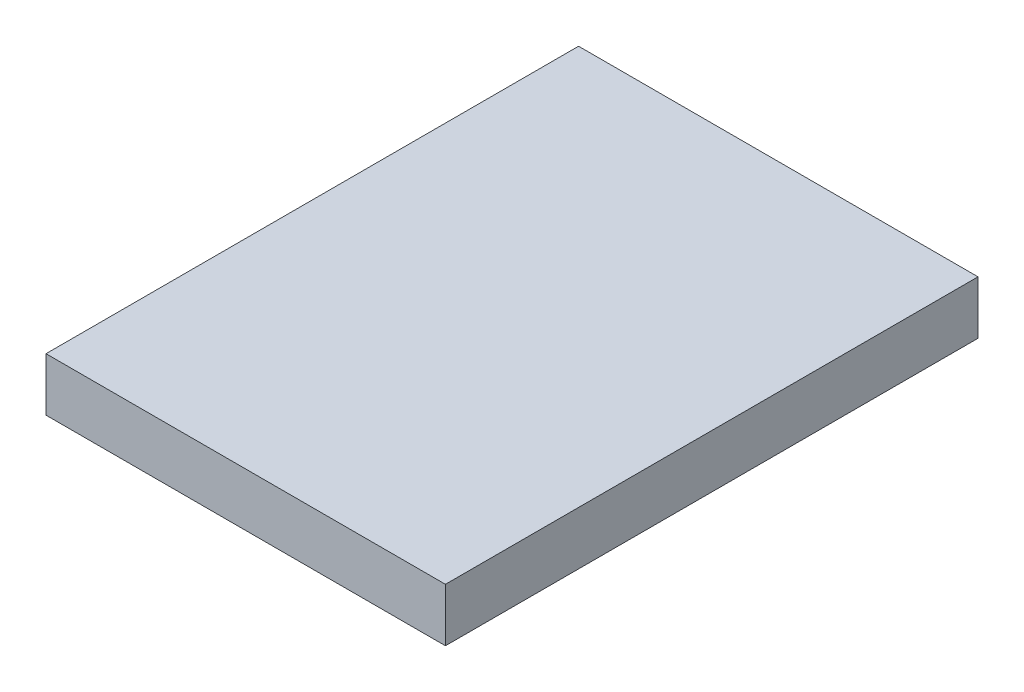
ISO-10303-21;
HEADER;
FILE_DESCRIPTION(('STEP AP214'),'2;1');
FILE_NAME('part.step','',(''),(''),'','','');
FILE_SCHEMA(('AUTOMOTIVE_DESIGN { 1 0 10303 214 1 1 1 1 }'));
ENDSEC;
DATA;
#1=APPLICATION_CONTEXT('core data for automotive mechanical design processes');
#2=APPLICATION_PROTOCOL_DEFINITION('international standard','automotive_design',2000,#1);
#3=PRODUCT_CONTEXT('',#1,'mechanical');
#4=PRODUCT('Part','Part','',(#3));
#5=PRODUCT_RELATED_PRODUCT_CATEGORY('part','',(#4));
#6=PRODUCT_DEFINITION_FORMATION('','',#4);
#7=PRODUCT_DEFINITION_CONTEXT('part definition',#1,'design');
#8=PRODUCT_DEFINITION('design','',#6,#7);
#9=PRODUCT_DEFINITION_SHAPE('','',#8);
#10=(LENGTH_UNIT() NAMED_UNIT(*) SI_UNIT(.MILLI.,.METRE.));
#11=(NAMED_UNIT(*) PLANE_ANGLE_UNIT() SI_UNIT($,.RADIAN.));
#12=(NAMED_UNIT(*) SI_UNIT($,.STERADIAN.) SOLID_ANGLE_UNIT());
#13=UNCERTAINTY_MEASURE_WITH_UNIT(LENGTH_MEASURE(1.E-05),#10,'distance_accuracy_value','');
#14=(GEOMETRIC_REPRESENTATION_CONTEXT(3) GLOBAL_UNCERTAINTY_ASSIGNED_CONTEXT((#13)) GLOBAL_UNIT_ASSIGNED_CONTEXT((#10,
#11,#12)) REPRESENTATION_CONTEXT('',''));
#15=CARTESIAN_POINT('',(0.,0.,0.));
#16=DIRECTION('',(0.,0.,1.));
#17=DIRECTION('',(1.,0.,0.));
#18=AXIS2_PLACEMENT_3D('',#15,#16,#17);
#19=CARTESIAN_POINT('',(0.,2000.,0.));
#20=DIRECTION('',(1.,0.,0.));
#21=DIRECTION('',(0.,0.,-1.));
#22=AXIS2_PLACEMENT_3D('',#19,#20,#21);
#23=PLANE('',#22);
#24=DIRECTION('',(0.,0.,1.));
#25=VECTOR('',#24,1.);
#26=CARTESIAN_POINT('',(0.,0.,0.));
#27=LINE('',#26,#25);
#28=CARTESIAN_POINT('',(0.,0.,0.));
#29=VERTEX_POINT('',#28);
#30=CARTESIAN_POINT('',(2.44929359829471E-12,0.,20000.));
#31=VERTEX_POINT('',#30);
#32=EDGE_CURVE('E96',#29,#31,#27,.T.);
#33=ORIENTED_EDGE('',*,*,#32,.T.);
#34=DIRECTION('',(0.,-1.,0.));
#35=VECTOR('',#34,1.);
#36=CARTESIAN_POINT('',(2.44929359829471E-12,2000.,20000.));
#37=LINE('',#36,#35);
#38=CARTESIAN_POINT('',(2.44929359829471E-12,2000.,20000.));
#39=VERTEX_POINT('',#38);
#40=EDGE_CURVE('E11',#39,#31,#37,.T.);
#41=ORIENTED_EDGE('',*,*,#40,.F.);
#42=DIRECTION('',(0.,0.,1.));
#43=VECTOR('',#42,1.);
#44=CARTESIAN_POINT('',(0.,2000.,0.));
#45=LINE('',#44,#43);
#46=CARTESIAN_POINT('',(0.,2000.,0.));
#47=VERTEX_POINT('',#46);
#48=EDGE_CURVE('E84',#47,#39,#45,.T.);
#49=ORIENTED_EDGE('',*,*,#48,.F.);
#50=DIRECTION('',(0.,-1.,0.));
#51=VECTOR('',#50,1.);
#52=CARTESIAN_POINT('',(0.,2000.,0.));
#53=LINE('',#52,#51);
#54=EDGE_CURVE('E92',#47,#29,#53,.T.);
#55=ORIENTED_EDGE('',*,*,#54,.T.);
#56=EDGE_LOOP('',(#33,#41,#49,#55));
#57=FACE_BOUND('',#56,.T.);
#58=ADVANCED_FACE('F33',(#57),#23,.F.);
#59=CARTESIAN_POINT('',(2.44929359829471E-12,2000.,20000.));
#60=DIRECTION('',(0.,0.,-1.));
#61=DIRECTION('',(-1.,0.,0.));
#62=AXIS2_PLACEMENT_3D('',#59,#60,#61);
#63=PLANE('',#62);
#64=DIRECTION('',(1.,0.,0.));
#65=VECTOR('',#64,1.);
#66=CARTESIAN_POINT('',(2.44929359829471E-12,0.,20000.));
#67=LINE('',#66,#65);
#68=CARTESIAN_POINT('',(15000.,0.,20000.));
#69=VERTEX_POINT('',#68);
#70=EDGE_CURVE('E88',#31,#69,#67,.T.);
#71=ORIENTED_EDGE('',*,*,#70,.T.);
#72=DIRECTION('',(0.,-1.,0.));
#73=VECTOR('',#72,1.);
#74=CARTESIAN_POINT('',(15000.,2000.,20000.));
#75=LINE('',#74,#73);
#76=CARTESIAN_POINT('',(15000.,2000.,20000.));
#77=VERTEX_POINT('',#76);
#78=EDGE_CURVE('E41',#77,#69,#75,.T.);
#79=ORIENTED_EDGE('',*,*,#78,.F.);
#80=DIRECTION('',(1.,0.,0.));
#81=VECTOR('',#80,1.);
#82=CARTESIAN_POINT('',(2.44929359829471E-12,2000.,20000.));
#83=LINE('',#82,#81);
#84=EDGE_CURVE('E79',#39,#77,#83,.T.);
#85=ORIENTED_EDGE('',*,*,#84,.F.);
#86=ORIENTED_EDGE('',*,*,#40,.T.);
#87=EDGE_LOOP('',(#71,#79,#85,#86));
#88=FACE_BOUND('',#87,.T.);
#89=ADVANCED_FACE('F87',(#88),#63,.F.);
#90=CARTESIAN_POINT('',(15000.,2000.,-1.83697019872103E-12));
#91=DIRECTION('',(-1.,0.,0.));
#92=DIRECTION('',(0.,0.,1.));
#93=AXIS2_PLACEMENT_3D('',#90,#91,#92);
#94=PLANE('',#93);
#95=DIRECTION('',(0.,0.,-1.));
#96=VECTOR('',#95,1.);
#97=CARTESIAN_POINT('',(15000.,0.,-1.83697019872103E-12));
#98=LINE('',#97,#96);
#99=CARTESIAN_POINT('',(15000.,0.,-1.83697019872103E-12));
#100=VERTEX_POINT('',#99);
#101=EDGE_CURVE('E66',#69,#100,#98,.T.);
#102=ORIENTED_EDGE('',*,*,#101,.T.);
#103=DIRECTION('',(0.,-1.,0.));
#104=VECTOR('',#103,1.);
#105=CARTESIAN_POINT('',(15000.,2000.,-1.83697019872103E-12));
#106=LINE('',#105,#104);
#107=CARTESIAN_POINT('',(15000.,2000.,-1.83697019872103E-12));
#108=VERTEX_POINT('',#107);
#109=EDGE_CURVE('E89',#108,#100,#106,.T.);
#110=ORIENTED_EDGE('',*,*,#109,.F.);
#111=DIRECTION('',(0.,0.,-1.));
#112=VECTOR('',#111,1.);
#113=CARTESIAN_POINT('',(15000.,2000.,-1.83697019872103E-12));
#114=LINE('',#113,#112);
#115=EDGE_CURVE('E82',#77,#108,#114,.T.);
#116=ORIENTED_EDGE('',*,*,#115,.F.);
#117=ORIENTED_EDGE('',*,*,#78,.T.);
#118=EDGE_LOOP('',(#102,#110,#116,#117));
#119=FACE_BOUND('',#118,.T.);
#120=ADVANCED_FACE('F90',(#119),#94,.F.);
#121=CARTESIAN_POINT('',(0.,2000.,0.));
#122=DIRECTION('',(0.,0.,1.));
#123=DIRECTION('',(1.,0.,0.));
#124=AXIS2_PLACEMENT_3D('',#121,#122,#123);
#125=PLANE('',#124);
#126=DIRECTION('',(-1.,0.,0.));
#127=VECTOR('',#126,1.);
#128=CARTESIAN_POINT('',(0.,0.,0.));
#129=LINE('',#128,#127);
#130=EDGE_CURVE('E72',#100,#29,#129,.T.);
#131=ORIENTED_EDGE('',*,*,#130,.T.);
#132=ORIENTED_EDGE('',*,*,#54,.F.);
#133=DIRECTION('',(-1.,0.,0.));
#134=VECTOR('',#133,1.);
#135=CARTESIAN_POINT('',(0.,2000.,0.));
#136=LINE('',#135,#134);
#137=EDGE_CURVE('E49',#108,#47,#136,.T.);
#138=ORIENTED_EDGE('',*,*,#137,.F.);
#139=ORIENTED_EDGE('',*,*,#109,.T.);
#140=EDGE_LOOP('',(#131,#132,#138,#139));
#141=FACE_BOUND('',#140,.T.);
#142=ADVANCED_FACE('F103',(#141),#125,.F.);
#143=CARTESIAN_POINT('',(0.,2000.,0.));
#144=DIRECTION('',(0.,1.,0.));
#145=DIRECTION('',(0.,0.,1.));
#146=AXIS2_PLACEMENT_3D('',#143,#144,#145);
#147=PLANE('',#146);
#148=ORIENTED_EDGE('',*,*,#48,.T.);
#149=ORIENTED_EDGE('',*,*,#84,.T.);
#150=ORIENTED_EDGE('',*,*,#115,.T.);
#151=ORIENTED_EDGE('',*,*,#137,.T.);
#152=EDGE_LOOP('',(#148,#149,#150,#151));
#153=FACE_BOUND('',#152,.T.);
#154=ADVANCED_FACE('F80',(#153),#147,.T.);
#155=CARTESIAN_POINT('',(0.,0.,0.));
#156=DIRECTION('',(0.,1.,0.));
#157=DIRECTION('',(0.,0.,1.));
#158=AXIS2_PLACEMENT_3D('',#155,#156,#157);
#159=PLANE('',#158);
#160=ORIENTED_EDGE('',*,*,#32,.F.);
#161=ORIENTED_EDGE('',*,*,#130,.F.);
#162=ORIENTED_EDGE('',*,*,#101,.F.);
#163=ORIENTED_EDGE('',*,*,#70,.F.);
#164=EDGE_LOOP('',(#160,#161,#162,#163));
#165=FACE_BOUND('',#164,.T.);
#166=ADVANCED_FACE('F106',(#165),#159,.F.);
#167=CLOSED_SHELL('',(#58,#89,#120,#142,#154,#166));
#168=MANIFOLD_SOLID_BREP('B2',#167);
#169=ADVANCED_BREP_SHAPE_REPRESENTATION('',(#18,#168),#14);
#170=SHAPE_DEFINITION_REPRESENTATION(#9,#169);
ENDSEC;
END-ISO-10303-21;
